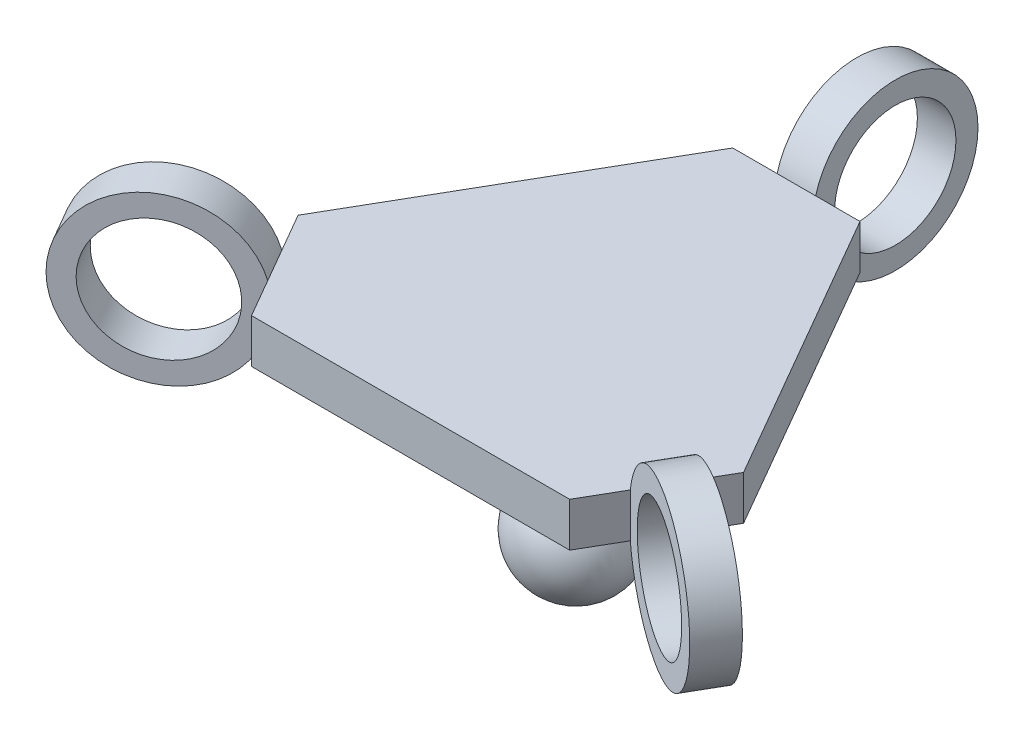
ISO-10303-21;
HEADER;
FILE_DESCRIPTION(('STEP AP214'),'2;1');
FILE_NAME('part.step','',(''),(''),'','','');
FILE_SCHEMA(('AUTOMOTIVE_DESIGN { 1 0 10303 214 1 1 1 1 }'));
ENDSEC;
DATA;
#1=APPLICATION_CONTEXT('core data for automotive mechanical design processes');
#2=APPLICATION_PROTOCOL_DEFINITION('international standard','automotive_design',2000,#1);
#3=PRODUCT_CONTEXT('',#1,'mechanical');
#4=PRODUCT('Part','Part','',(#3));
#5=PRODUCT_RELATED_PRODUCT_CATEGORY('part','',(#4));
#6=PRODUCT_DEFINITION_FORMATION('','',#4);
#7=PRODUCT_DEFINITION_CONTEXT('part definition',#1,'design');
#8=PRODUCT_DEFINITION('design','',#6,#7);
#9=PRODUCT_DEFINITION_SHAPE('','',#8);
#10=(LENGTH_UNIT() NAMED_UNIT(*) SI_UNIT(.MILLI.,.METRE.));
#11=(NAMED_UNIT(*) PLANE_ANGLE_UNIT() SI_UNIT($,.RADIAN.));
#12=(NAMED_UNIT(*) SI_UNIT($,.STERADIAN.) SOLID_ANGLE_UNIT());
#13=UNCERTAINTY_MEASURE_WITH_UNIT(LENGTH_MEASURE(1.E-05),#10,'distance_accuracy_value','');
#14=(GEOMETRIC_REPRESENTATION_CONTEXT(3) GLOBAL_UNCERTAINTY_ASSIGNED_CONTEXT((#13)) GLOBAL_UNIT_ASSIGNED_CONTEXT((#10,
#11,#12)) REPRESENTATION_CONTEXT('',''));
#15=CARTESIAN_POINT('',(0.,0.,0.));
#16=DIRECTION('',(0.,0.,1.));
#17=DIRECTION('',(1.,0.,0.));
#18=AXIS2_PLACEMENT_3D('',#15,#16,#17);
#19=CARTESIAN_POINT('',(0.,-26.,0.));
#20=DIRECTION('',(0.,0.,1.));
#21=DIRECTION('',(1.,0.,0.));
#22=AXIS2_PLACEMENT_3D('',#19,#20,#21);
#23=SPHERICAL_SURFACE('',#22,10.);
#24=CARTESIAN_POINT('',(0.,-26.,10.));
#25=VERTEX_POINT('',#24);
#26=VERTEX_LOOP('',#25);
#27=FACE_BOUND('',#26,.T.);
#28=ADVANCED_FACE('F42',(#27),#23,.T.);
#29=CLOSED_SHELL('',(#28));
#30=MANIFOLD_SOLID_BREP('B2',#29);
#31=CARTESIAN_POINT('',(0.,8.,0.));
#32=DIRECTION('',(0.,1.,0.));
#33=DIRECTION('',(0.,0.,1.));
#34=AXIS2_PLACEMENT_3D('',#31,#32,#33);
#35=PLANE('',#34);
#36=DIRECTION('',(-0.499999999999992,0.,0.866025403784443));
#37=VECTOR('',#36,1.);
#38=CARTESIAN_POINT('',(36.3877184662043,8.,16.9670071673316));
#39=LINE('',#38,#37);
#40=CARTESIAN_POINT('',(36.3877184662043,8.,16.9670071673316));
#41=VERTEX_POINT('',#40);
#42=CARTESIAN_POINT('',(32.8877184662044,8.,23.0291849938227));
#43=VERTEX_POINT('',#42);
#44=EDGE_CURVE('E73',#41,#43,#39,.T.);
#45=ORIENTED_EDGE('',*,*,#44,.F.);
#46=DIRECTION('',(0.866025403784443,0.,0.499999999999992));
#47=VECTOR('',#46,1.);
#48=CARTESIAN_POINT('',(1.74999999999997,8.,-3.03108891324555));
#49=LINE('',#48,#47);
#50=CARTESIAN_POINT('',(36.3910161513777,8.,16.9689110867541));
#51=VERTEX_POINT('',#50);
#52=EDGE_CURVE('E181',#41,#51,#49,.T.);
#53=ORIENTED_EDGE('',*,*,#52,.T.);
#54=DIRECTION('',(0.5,0.,-0.866025403784439));
#55=VECTOR('',#54,1.);
#56=CARTESIAN_POINT('',(28.8675134594813,8.,30.));
#57=LINE('',#56,#55);
#58=CARTESIAN_POINT('',(40.4145188432738,8.,9.99999999999998));
#59=VERTEX_POINT('',#58);
#60=EDGE_CURVE('E178',#51,#59,#57,.T.);
#61=ORIENTED_EDGE('',*,*,#60,.T.);
#62=DIRECTION('',(-0.5,0.,-0.866025403784438));
#63=VECTOR('',#62,1.);
#64=CARTESIAN_POINT('',(40.4145188432738,8.,9.99999999999998));
#65=LINE('',#64,#63);
#66=CARTESIAN_POINT('',(11.5470053837925,8.,-40.));
#67=VERTEX_POINT('',#66);
#68=EDGE_CURVE('E261',#59,#67,#65,.T.);
#69=ORIENTED_EDGE('',*,*,#68,.T.);
#70=DIRECTION('',(-1.,0.,0.));
#71=VECTOR('',#70,1.);
#72=CARTESIAN_POINT('',(11.5470053837925,8.,-40.));
#73=LINE('',#72,#71);
#74=CARTESIAN_POINT('',(3.5,8.,-40.));
#75=VERTEX_POINT('',#74);
#76=EDGE_CURVE('E265',#67,#75,#73,.T.);
#77=ORIENTED_EDGE('',*,*,#76,.T.);
#78=DIRECTION('',(0.,0.,-1.));
#79=VECTOR('',#78,1.);
#80=CARTESIAN_POINT('',(3.5,8.,0.));
#81=LINE('',#80,#79);
#82=CARTESIAN_POINT('',(3.5,8.,-39.9961921611549));
#83=VERTEX_POINT('',#82);
#84=EDGE_CURVE('E248',#83,#75,#81,.T.);
#85=ORIENTED_EDGE('',*,*,#84,.F.);
#86=DIRECTION('',(1.,0.,0.));
#87=VECTOR('',#86,1.);
#88=CARTESIAN_POINT('',(-3.5,8.,-39.9961921611549));
#89=LINE('',#88,#87);
#90=CARTESIAN_POINT('',(-3.5,8.,-39.9961921611549));
#91=VERTEX_POINT('',#90);
#92=EDGE_CURVE('E258',#91,#83,#89,.T.);
#93=ORIENTED_EDGE('',*,*,#92,.F.);
#94=DIRECTION('',(0.,0.,-1.));
#95=VECTOR('',#94,1.);
#96=CARTESIAN_POINT('',(-3.5,8.,0.));
#97=LINE('',#96,#95);
#98=CARTESIAN_POINT('',(-3.5,8.,-40.));
#99=VERTEX_POINT('',#98);
#100=EDGE_CURVE('E253',#91,#99,#97,.T.);
#101=ORIENTED_EDGE('',*,*,#100,.T.);
#102=CARTESIAN_POINT('',(-11.5470053837925,8.,-40.));
#103=VERTEX_POINT('',#102);
#104=EDGE_CURVE('E264',#99,#103,#73,.T.);
#105=ORIENTED_EDGE('',*,*,#104,.T.);
#106=DIRECTION('',(-0.5,0.,0.866025403784438));
#107=VECTOR('',#106,1.);
#108=CARTESIAN_POINT('',(-11.5470053837925,8.,-40.));
#109=LINE('',#108,#107);
#110=CARTESIAN_POINT('',(-40.4145188432738,8.,9.99999999999998));
#111=VERTEX_POINT('',#110);
#112=EDGE_CURVE('E268',#103,#111,#109,.T.);
#113=ORIENTED_EDGE('',*,*,#112,.T.);
#114=DIRECTION('',(0.5,0.,0.866025403784439));
#115=VECTOR('',#114,1.);
#116=CARTESIAN_POINT('',(-40.4145188432738,8.,9.99999999999998));
#117=LINE('',#116,#115);
#118=CARTESIAN_POINT('',(-36.3910161513775,8.,16.9689110867546));
#119=VERTEX_POINT('',#118);
#120=EDGE_CURVE('E271',#111,#119,#117,.T.);
#121=ORIENTED_EDGE('',*,*,#120,.T.);
#122=DIRECTION('',(-0.866025403784436,0.,0.500000000000004));
#123=VECTOR('',#122,1.);
#124=CARTESIAN_POINT('',(-1.75000000000001,8.,-3.03108891324553));
#125=LINE('',#124,#123);
#126=CARTESIAN_POINT('',(-36.3877184662041,8.,16.9670071673321));
#127=VERTEX_POINT('',#126);
#128=EDGE_CURVE('E214',#127,#119,#125,.T.);
#129=ORIENTED_EDGE('',*,*,#128,.F.);
#130=DIRECTION('',(-0.500000000000004,0.,-0.866025403784436));
#131=VECTOR('',#130,1.);
#132=CARTESIAN_POINT('',(-32.887718466204,8.,23.0291849938231));
#133=LINE('',#132,#131);
#134=CARTESIAN_POINT('',(-32.887718466204,8.,23.0291849938231));
#135=VERTEX_POINT('',#134);
#136=EDGE_CURVE('E224',#135,#127,#133,.T.);
#137=ORIENTED_EDGE('',*,*,#136,.F.);
#138=DIRECTION('',(-0.866025403784436,0.,0.500000000000004));
#139=VECTOR('',#138,1.);
#140=CARTESIAN_POINT('',(1.75000000000001,8.,3.03108891324553));
#141=LINE('',#140,#139);
#142=CARTESIAN_POINT('',(-32.8910161513775,8.,23.0310889132457));
#143=VERTEX_POINT('',#142);
#144=EDGE_CURVE('E219',#135,#143,#141,.T.);
#145=ORIENTED_EDGE('',*,*,#144,.T.);
#146=CARTESIAN_POINT('',(-28.8675134594813,8.,30.));
#147=VERTEX_POINT('',#146);
#148=EDGE_CURVE('E270',#143,#147,#117,.T.);
#149=ORIENTED_EDGE('',*,*,#148,.T.);
#150=DIRECTION('',(1.,0.,0.));
#151=VECTOR('',#150,1.);
#152=CARTESIAN_POINT('',(-28.8675134594813,8.,30.));
#153=LINE('',#152,#151);
#154=CARTESIAN_POINT('',(28.8675134594813,8.,30.));
#155=VERTEX_POINT('',#154);
#156=EDGE_CURVE('E274',#147,#155,#153,.T.);
#157=ORIENTED_EDGE('',*,*,#156,.T.);
#158=CARTESIAN_POINT('',(32.8910161513777,8.,23.0310889132452));
#159=VERTEX_POINT('',#158);
#160=EDGE_CURVE('E276',#155,#159,#57,.T.);
#161=ORIENTED_EDGE('',*,*,#160,.T.);
#162=DIRECTION('',(0.866025403784443,0.,0.499999999999992));
#163=VECTOR('',#162,1.);
#164=CARTESIAN_POINT('',(-1.74999999999997,8.,3.03108891324555));
#165=LINE('',#164,#163);
#166=EDGE_CURVE('E69',#43,#159,#165,.T.);
#167=ORIENTED_EDGE('',*,*,#166,.F.);
#168=EDGE_LOOP('',(#45,#53,#61,#69,#77,#85,#93,#101,#105,#113,#121,#129,#137,#145,#149,#157,
#161,#167));
#169=FACE_BOUND('',#168,.T.);
#170=ADVANCED_FACE('F54',(#169),#35,.T.);
#171=CARTESIAN_POINT('',(28.8675134594813,8.,30.));
#172=DIRECTION('',(-0.866025403784439,0.,-0.5));
#173=DIRECTION('',(-0.5,0.,0.866025403784439));
#174=AXIS2_PLACEMENT_3D('',#171,#172,#173);
#175=PLANE('',#174);
#176=DIRECTION('',(0.,1.,0.));
#177=VECTOR('',#176,1.);
#178=CARTESIAN_POINT('',(36.3910161513777,8.,16.9689110867541));
#179=LINE('',#178,#177);
#180=CARTESIAN_POINT('',(36.3910161513777,0.,16.9689110867541));
#181=VERTEX_POINT('',#180);
#182=EDGE_CURVE('E176',#181,#51,#179,.T.);
#183=ORIENTED_EDGE('',*,*,#182,.F.);
#184=DIRECTION('',(0.5,0.,-0.866025403784439));
#185=VECTOR('',#184,1.);
#186=CARTESIAN_POINT('',(28.8675134594813,0.,30.));
#187=LINE('',#186,#185);
#188=CARTESIAN_POINT('',(40.4145188432738,0.,9.99999999999998));
#189=VERTEX_POINT('',#188);
#190=EDGE_CURVE('E159',#181,#189,#187,.T.);
#191=ORIENTED_EDGE('',*,*,#190,.T.);
#192=DIRECTION('',(0.,-1.,0.));
#193=VECTOR('',#192,1.);
#194=CARTESIAN_POINT('',(40.4145188432738,8.,9.99999999999998));
#195=LINE('',#194,#193);
#196=EDGE_CURVE('E278',#59,#189,#195,.T.);
#197=ORIENTED_EDGE('',*,*,#196,.F.);
#198=ORIENTED_EDGE('',*,*,#60,.F.);
#199=EDGE_LOOP('',(#183,#191,#197,#198));
#200=FACE_BOUND('',#199,.T.);
#201=ADVANCED_FACE('F177',(#200),#175,.F.);
#202=CARTESIAN_POINT('',(-40.4145188432738,8.,9.99999999999998));
#203=DIRECTION('',(0.866025403784439,0.,-0.5));
#204=DIRECTION('',(-0.5,0.,-0.866025403784439));
#205=AXIS2_PLACEMENT_3D('',#202,#203,#204);
#206=PLANE('',#205);
#207=DIRECTION('',(0.,1.,0.));
#208=VECTOR('',#207,1.);
#209=CARTESIAN_POINT('',(-32.8910161513774,8.,23.0310889132457));
#210=LINE('',#209,#208);
#211=CARTESIAN_POINT('',(-32.8910161513774,0.,23.0310889132457));
#212=VERTEX_POINT('',#211);
#213=EDGE_CURVE('E221',#212,#143,#210,.T.);
#214=ORIENTED_EDGE('',*,*,#213,.F.);
#215=DIRECTION('',(0.5,0.,0.866025403784439));
#216=VECTOR('',#215,1.);
#217=CARTESIAN_POINT('',(-40.4145188432738,0.,9.99999999999998));
#218=LINE('',#217,#216);
#219=CARTESIAN_POINT('',(-28.8675134594813,0.,30.));
#220=VERTEX_POINT('',#219);
#221=EDGE_CURVE('E287',#212,#220,#218,.T.);
#222=ORIENTED_EDGE('',*,*,#221,.T.);
#223=DIRECTION('',(0.,-1.,0.));
#224=VECTOR('',#223,1.);
#225=CARTESIAN_POINT('',(-28.8675134594813,8.,30.));
#226=LINE('',#225,#224);
#227=EDGE_CURVE('E296',#147,#220,#226,.T.);
#228=ORIENTED_EDGE('',*,*,#227,.F.);
#229=ORIENTED_EDGE('',*,*,#148,.F.);
#230=EDGE_LOOP('',(#214,#222,#228,#229));
#231=FACE_BOUND('',#230,.T.);
#232=ADVANCED_FACE('F328',(#231),#206,.F.);
#233=CARTESIAN_POINT('',(11.5470053837925,8.,-40.));
#234=DIRECTION('',(0.,0.,1.));
#235=DIRECTION('',(1.,0.,0.));
#236=AXIS2_PLACEMENT_3D('',#233,#234,#235);
#237=PLANE('',#236);
#238=DIRECTION('',(0.,1.,0.));
#239=VECTOR('',#238,1.);
#240=CARTESIAN_POINT('',(-3.5,8.,-40.));
#241=LINE('',#240,#239);
#242=CARTESIAN_POINT('',(-3.5,0.,-40.));
#243=VERTEX_POINT('',#242);
#244=EDGE_CURVE('E255',#243,#99,#241,.T.);
#245=ORIENTED_EDGE('',*,*,#244,.F.);
#246=DIRECTION('',(-1.,0.,0.));
#247=VECTOR('',#246,1.);
#248=CARTESIAN_POINT('',(11.5470053837925,0.,-40.));
#249=LINE('',#248,#247);
#250=CARTESIAN_POINT('',(-11.5470053837925,0.,-40.));
#251=VERTEX_POINT('',#250);
#252=EDGE_CURVE('E280',#243,#251,#249,.T.);
#253=ORIENTED_EDGE('',*,*,#252,.T.);
#254=DIRECTION('',(0.,-1.,0.));
#255=VECTOR('',#254,1.);
#256=CARTESIAN_POINT('',(-11.5470053837925,8.,-40.));
#257=LINE('',#256,#255);
#258=EDGE_CURVE('E62',#103,#251,#257,.T.);
#259=ORIENTED_EDGE('',*,*,#258,.F.);
#260=ORIENTED_EDGE('',*,*,#104,.F.);
#261=EDGE_LOOP('',(#245,#253,#259,#260));
#262=FACE_BOUND('',#261,.T.);
#263=ADVANCED_FACE('F378',(#262),#237,.F.);
#264=CARTESIAN_POINT('',(40.4145188432738,8.,9.99999999999998));
#265=DIRECTION('',(-0.866025403784439,0.,0.5));
#266=DIRECTION('',(0.5,0.,0.866025403784439));
#267=AXIS2_PLACEMENT_3D('',#264,#265,#266);
#268=PLANE('',#267);
#269=DIRECTION('',(-0.5,0.,-0.866025403784438));
#270=VECTOR('',#269,1.);
#271=CARTESIAN_POINT('',(40.4145188432738,0.,9.99999999999998));
#272=LINE('',#271,#270);
#273=CARTESIAN_POINT('',(11.5470053837925,0.,-40.));
#274=VERTEX_POINT('',#273);
#275=EDGE_CURVE('E167',#189,#274,#272,.T.);
#276=ORIENTED_EDGE('',*,*,#275,.T.);
#277=DIRECTION('',(0.,-1.,0.));
#278=VECTOR('',#277,1.);
#279=CARTESIAN_POINT('',(11.5470053837925,8.,-40.));
#280=LINE('',#279,#278);
#281=EDGE_CURVE('E40',#67,#274,#280,.T.);
#282=ORIENTED_EDGE('',*,*,#281,.F.);
#283=ORIENTED_EDGE('',*,*,#68,.F.);
#284=ORIENTED_EDGE('',*,*,#196,.T.);
#285=EDGE_LOOP('',(#276,#282,#283,#284));
#286=FACE_BOUND('',#285,.T.);
#287=ADVANCED_FACE('F56',(#286),#268,.F.);
#288=CARTESIAN_POINT('',(3.5,0.,-40.));
#289=VERTEX_POINT('',#288);
#290=EDGE_CURVE('E281',#274,#289,#249,.T.);
#291=ORIENTED_EDGE('',*,*,#290,.T.);
#292=DIRECTION('',(0.,1.,0.));
#293=VECTOR('',#292,1.);
#294=CARTESIAN_POINT('',(3.5,8.,-40.));
#295=LINE('',#294,#293);
#296=EDGE_CURVE('E251',#289,#75,#295,.T.);
#297=ORIENTED_EDGE('',*,*,#296,.T.);
#298=ORIENTED_EDGE('',*,*,#76,.F.);
#299=ORIENTED_EDGE('',*,*,#281,.T.);
#300=EDGE_LOOP('',(#291,#297,#298,#299));
#301=FACE_BOUND('',#300,.T.);
#302=ADVANCED_FACE('F375',(#301),#237,.F.);
#303=CARTESIAN_POINT('',(-11.5470053837925,8.,-40.));
#304=DIRECTION('',(0.866025403784439,0.,0.5));
#305=DIRECTION('',(0.5,0.,-0.866025403784438));
#306=AXIS2_PLACEMENT_3D('',#303,#304,#305);
#307=PLANE('',#306);
#308=DIRECTION('',(-0.5,0.,0.866025403784438));
#309=VECTOR('',#308,1.);
#310=CARTESIAN_POINT('',(-11.5470053837925,0.,-40.));
#311=LINE('',#310,#309);
#312=CARTESIAN_POINT('',(-40.4145188432738,0.,9.99999999999998));
#313=VERTEX_POINT('',#312);
#314=EDGE_CURVE('E284',#251,#313,#311,.T.);
#315=ORIENTED_EDGE('',*,*,#314,.T.);
#316=DIRECTION('',(0.,-1.,0.));
#317=VECTOR('',#316,1.);
#318=CARTESIAN_POINT('',(-40.4145188432738,8.,9.99999999999998));
#319=LINE('',#318,#317);
#320=EDGE_CURVE('E299',#111,#313,#319,.T.);
#321=ORIENTED_EDGE('',*,*,#320,.F.);
#322=ORIENTED_EDGE('',*,*,#112,.F.);
#323=ORIENTED_EDGE('',*,*,#258,.T.);
#324=EDGE_LOOP('',(#315,#321,#322,#323));
#325=FACE_BOUND('',#324,.T.);
#326=ADVANCED_FACE('F306',(#325),#307,.F.);
#327=CARTESIAN_POINT('',(-36.3910161513775,0.,16.9689110867546));
#328=VERTEX_POINT('',#327);
#329=EDGE_CURVE('E288',#313,#328,#218,.T.);
#330=ORIENTED_EDGE('',*,*,#329,.T.);
#331=DIRECTION('',(0.,1.,0.));
#332=VECTOR('',#331,1.);
#333=CARTESIAN_POINT('',(-36.3910161513775,8.,16.9689110867546));
#334=LINE('',#333,#332);
#335=EDGE_CURVE('E217',#328,#119,#334,.T.);
#336=ORIENTED_EDGE('',*,*,#335,.T.);
#337=ORIENTED_EDGE('',*,*,#120,.F.);
#338=ORIENTED_EDGE('',*,*,#320,.T.);
#339=EDGE_LOOP('',(#330,#336,#337,#338));
#340=FACE_BOUND('',#339,.T.);
#341=ADVANCED_FACE('F314',(#340),#206,.F.);
#342=CARTESIAN_POINT('',(-28.8675134594813,8.,30.));
#343=DIRECTION('',(0.,0.,-1.));
#344=DIRECTION('',(-1.,0.,0.));
#345=AXIS2_PLACEMENT_3D('',#342,#343,#344);
#346=PLANE('',#345);
#347=DIRECTION('',(1.,0.,0.));
#348=VECTOR('',#347,1.);
#349=CARTESIAN_POINT('',(-28.8675134594813,0.,30.));
#350=LINE('',#349,#348);
#351=CARTESIAN_POINT('',(28.8675134594813,0.,30.));
#352=VERTEX_POINT('',#351);
#353=EDGE_CURVE('E172',#220,#352,#350,.T.);
#354=ORIENTED_EDGE('',*,*,#353,.T.);
#355=DIRECTION('',(0.,-1.,0.));
#356=VECTOR('',#355,1.);
#357=CARTESIAN_POINT('',(28.8675134594813,8.,30.));
#358=LINE('',#357,#356);
#359=EDGE_CURVE('E293',#155,#352,#358,.T.);
#360=ORIENTED_EDGE('',*,*,#359,.F.);
#361=ORIENTED_EDGE('',*,*,#156,.F.);
#362=ORIENTED_EDGE('',*,*,#227,.T.);
#363=EDGE_LOOP('',(#354,#360,#361,#362));
#364=FACE_BOUND('',#363,.T.);
#365=ADVANCED_FACE('F334',(#364),#346,.F.);
#366=CARTESIAN_POINT('',(32.8910161513777,0.,23.0310889132452));
#367=VERTEX_POINT('',#366);
#368=EDGE_CURVE('E171',#352,#367,#187,.T.);
#369=ORIENTED_EDGE('',*,*,#368,.T.);
#370=DIRECTION('',(0.,1.,0.));
#371=VECTOR('',#370,1.);
#372=CARTESIAN_POINT('',(32.8910161513778,8.,23.0310889132452));
#373=LINE('',#372,#371);
#374=EDGE_CURVE('E194',#367,#159,#373,.T.);
#375=ORIENTED_EDGE('',*,*,#374,.T.);
#376=ORIENTED_EDGE('',*,*,#160,.F.);
#377=ORIENTED_EDGE('',*,*,#359,.T.);
#378=EDGE_LOOP('',(#369,#375,#376,#377));
#379=FACE_BOUND('',#378,.T.);
#380=ADVANCED_FACE('F337',(#379),#175,.F.);
#381=CARTESIAN_POINT('',(0.,0.,0.));
#382=DIRECTION('',(0.,1.,0.));
#383=DIRECTION('',(0.,0.,1.));
#384=AXIS2_PLACEMENT_3D('',#381,#382,#383);
#385=PLANE('',#384);
#386=CARTESIAN_POINT('',(0.,0.,0.));
#387=DIRECTION('',(0.,1.,0.));
#388=DIRECTION('',(0.,0.,1.));
#389=AXIS2_PLACEMENT_3D('',#386,#387,#388);
#390=CIRCLE('',#389,5.);
#391=CARTESIAN_POINT('',(0.,0.,5.));
#392=VERTEX_POINT('',#391);
#393=EDGE_CURVE('E233',#392,#392,#390,.T.);
#394=ORIENTED_EDGE('',*,*,#393,.T.);
#395=EDGE_LOOP('',(#394));
#396=FACE_BOUND('',#395,.T.);
#397=ORIENTED_EDGE('',*,*,#275,.F.);
#398=ORIENTED_EDGE('',*,*,#190,.F.);
#399=DIRECTION('',(0.499999999999992,0.,-0.866025403784443));
#400=VECTOR('',#399,1.);
#401=CARTESIAN_POINT('',(28.8675134594816,0.,29.9999999999997));
#402=LINE('',#401,#400);
#403=EDGE_CURVE('E164',#367,#181,#402,.T.);
#404=ORIENTED_EDGE('',*,*,#403,.F.);
#405=ORIENTED_EDGE('',*,*,#368,.F.);
#406=ORIENTED_EDGE('',*,*,#353,.F.);
#407=ORIENTED_EDGE('',*,*,#221,.F.);
#408=DIRECTION('',(0.500000000000004,0.,0.866025403784436));
#409=VECTOR('',#408,1.);
#410=CARTESIAN_POINT('',(-40.4145188432738,0.,10.0000000000002));
#411=LINE('',#410,#409);
#412=EDGE_CURVE('E227',#328,#212,#411,.T.);
#413=ORIENTED_EDGE('',*,*,#412,.F.);
#414=ORIENTED_EDGE('',*,*,#329,.F.);
#415=ORIENTED_EDGE('',*,*,#314,.F.);
#416=ORIENTED_EDGE('',*,*,#252,.F.);
#417=EDGE_CURVE('E285',#289,#243,#249,.T.);
#418=ORIENTED_EDGE('',*,*,#417,.F.);
#419=ORIENTED_EDGE('',*,*,#290,.F.);
#420=EDGE_LOOP('',(#397,#398,#404,#405,#406,#407,#413,#414,#415,#416,#418,#419));
#421=FACE_BOUND('',#420,.T.);
#422=ADVANCED_FACE('F161',(#396,#421),#385,.F.);
#423=CARTESIAN_POINT('',(-3.5,4.00688116010952,-54.4549266123616));
#424=DIRECTION('',(1.,0.,0.));
#425=DIRECTION('',(0.,0.,-1.));
#426=AXIS2_PLACEMENT_3D('',#423,#424,#425);
#427=PLANE('',#426);
#428=CARTESIAN_POINT('',(-3.5,4.00688116010952,-54.4549266123616));
#429=DIRECTION('',(1.,0.,0.));
#430=DIRECTION('',(0.,0.,-1.));
#431=AXIS2_PLACEMENT_3D('',#428,#429,#430);
#432=CIRCLE('',#431,11.);
#433=CARTESIAN_POINT('',(-3.5,4.00688116010952,-65.4549266123616));
#434=VERTEX_POINT('',#433);
#435=EDGE_CURVE('E239',#434,#434,#432,.T.);
#436=ORIENTED_EDGE('',*,*,#435,.T.);
#437=EDGE_LOOP('',(#436));
#438=FACE_BOUND('',#437,.T.);
#439=CARTESIAN_POINT('',(-3.5,4.00688116010952,-54.4549266123616));
#440=DIRECTION('',(1.,0.,0.));
#441=DIRECTION('',(0.,0.,-1.));
#442=AXIS2_PLACEMENT_3D('',#439,#440,#441);
#443=CIRCLE('',#442,15.);
#444=EDGE_CURVE('E245',#243,#91,#443,.T.);
#445=ORIENTED_EDGE('',*,*,#444,.F.);
#446=ORIENTED_EDGE('',*,*,#244,.T.);
#447=ORIENTED_EDGE('',*,*,#100,.F.);
#448=EDGE_LOOP('',(#445,#446,#447));
#449=FACE_BOUND('',#448,.T.);
#450=ADVANCED_FACE('F366',(#438,#449),#427,.F.);
#451=CARTESIAN_POINT('',(3.5,4.00688116010952,-54.4549266123616));
#452=DIRECTION('',(1.,0.,0.));
#453=DIRECTION('',(0.,0.,-1.));
#454=AXIS2_PLACEMENT_3D('',#451,#452,#453);
#455=PLANE('',#454);
#456=CARTESIAN_POINT('',(3.5,4.00688116010952,-54.4549266123616));
#457=DIRECTION('',(1.,0.,0.));
#458=DIRECTION('',(0.,0.,-1.));
#459=AXIS2_PLACEMENT_3D('',#456,#457,#458);
#460=CIRCLE('',#459,11.);
#461=CARTESIAN_POINT('',(3.5,4.00688116010952,-65.4549266123616));
#462=VERTEX_POINT('',#461);
#463=EDGE_CURVE('E236',#462,#462,#460,.T.);
#464=ORIENTED_EDGE('',*,*,#463,.F.);
#465=EDGE_LOOP('',(#464));
#466=FACE_BOUND('',#465,.T.);
#467=ORIENTED_EDGE('',*,*,#296,.F.);
#468=CARTESIAN_POINT('',(3.5,4.00688116010952,-54.4549266123616));
#469=DIRECTION('',(1.,0.,0.));
#470=DIRECTION('',(0.,0.,-1.));
#471=AXIS2_PLACEMENT_3D('',#468,#469,#470);
#472=CIRCLE('',#471,15.);
#473=EDGE_CURVE('E242',#289,#83,#472,.T.);
#474=ORIENTED_EDGE('',*,*,#473,.T.);
#475=ORIENTED_EDGE('',*,*,#84,.T.);
#476=EDGE_LOOP('',(#467,#474,#475));
#477=FACE_BOUND('',#476,.T.);
#478=ADVANCED_FACE('F395',(#466,#477),#455,.T.);
#479=CARTESIAN_POINT('',(-3.5,4.00688116010952,-54.4549266123616));
#480=DIRECTION('',(1.,0.,0.));
#481=DIRECTION('',(0.,0.,-1.));
#482=AXIS2_PLACEMENT_3D('',#479,#480,#481);
#483=CYLINDRICAL_SURFACE('',#482,15.);
#484=ORIENTED_EDGE('',*,*,#444,.T.);
#485=ORIENTED_EDGE('',*,*,#92,.T.);
#486=ORIENTED_EDGE('',*,*,#473,.F.);
#487=ORIENTED_EDGE('',*,*,#417,.T.);
#488=EDGE_LOOP('',(#484,#485,#486,#487));
#489=FACE_BOUND('',#488,.T.);
#490=ADVANCED_FACE('F363',(#489),#483,.T.);
#491=CARTESIAN_POINT('',(-16.,4.00688116010952,-54.4549266123616));
#492=DIRECTION('',(1.,0.,0.));
#493=DIRECTION('',(0.,0.,-1.));
#494=AXIS2_PLACEMENT_3D('',#491,#492,#493);
#495=CYLINDRICAL_SURFACE('',#494,11.);
#496=ORIENTED_EDGE('',*,*,#463,.T.);
#497=EDGE_LOOP('',(#496));
#498=FACE_BOUND('',#497,.T.);
#499=ORIENTED_EDGE('',*,*,#435,.F.);
#500=EDGE_LOOP('',(#499));
#501=FACE_BOUND('',#500,.T.);
#502=ADVANCED_FACE('F405',(#498,#501),#495,.F.);
#503=CARTESIAN_POINT('',(0.,-26.,0.));
#504=DIRECTION('',(0.,1.,0.));
#505=DIRECTION('',(0.,0.,1.));
#506=AXIS2_PLACEMENT_3D('',#503,#504,#505);
#507=CYLINDRICAL_SURFACE('',#506,5.);
#508=CARTESIAN_POINT('',(0.,-26.,0.));
#509=DIRECTION('',(0.,1.,0.));
#510=DIRECTION('',(0.,0.,1.));
#511=AXIS2_PLACEMENT_3D('',#508,#509,#510);
#512=CIRCLE('',#511,5.);
#513=CARTESIAN_POINT('',(0.,-26.,5.));
#514=VERTEX_POINT('',#513);
#515=EDGE_CURVE('E230',#514,#514,#512,.T.);
#516=ORIENTED_EDGE('',*,*,#515,.T.);
#517=EDGE_LOOP('',(#516));
#518=FACE_BOUND('',#517,.T.);
#519=ORIENTED_EDGE('',*,*,#393,.F.);
#520=EDGE_LOOP('',(#519));
#521=FACE_BOUND('',#520,.T.);
#522=ADVANCED_FACE('F411',(#518,#521),#507,.T.);
#523=CARTESIAN_POINT('',(0.,-26.,0.));
#524=DIRECTION('',(0.,1.,0.));
#525=DIRECTION('',(0.,0.,1.));
#526=AXIS2_PLACEMENT_3D('',#523,#524,#525);
#527=PLANE('',#526);
#528=ORIENTED_EDGE('',*,*,#515,.F.);
#529=EDGE_LOOP('',(#528));
#530=FACE_BOUND('',#529,.T.);
#531=ADVANCED_FACE('F415',(#530),#527,.F.);
#532=CARTESIAN_POINT('',(-45.4093498075223,4.00688116010952,30.2585522194265));
#533=DIRECTION('',(-0.500000000000004,0.,-0.866025403784436));
#534=DIRECTION('',(-0.866025403784436,0.,0.500000000000004));
#535=AXIS2_PLACEMENT_3D('',#532,#533,#534);
#536=PLANE('',#535);
#537=CARTESIAN_POINT('',(-45.4093498075223,4.00688116010952,30.2585522194265));
#538=DIRECTION('',(-0.500000000000004,0.,-0.866025403784436));
#539=DIRECTION('',(-0.866025403784436,0.,0.500000000000004));
#540=AXIS2_PLACEMENT_3D('',#537,#538,#539);
#541=CIRCLE('',#540,11.);
#542=CARTESIAN_POINT('',(-54.9356292491511,4.00688116010952,35.7585522194266));
#543=VERTEX_POINT('',#542);
#544=EDGE_CURVE('E205',#543,#543,#541,.T.);
#545=ORIENTED_EDGE('',*,*,#544,.T.);
#546=EDGE_LOOP('',(#545));
#547=FACE_BOUND('',#546,.T.);
#548=CARTESIAN_POINT('',(-45.4093498075223,4.00688116010952,30.2585522194265));
#549=DIRECTION('',(-0.500000000000004,0.,-0.866025403784436));
#550=DIRECTION('',(-0.866025403784436,0.,0.500000000000004));
#551=AXIS2_PLACEMENT_3D('',#548,#549,#550);
#552=CIRCLE('',#551,15.);
#553=EDGE_CURVE('E211',#212,#135,#552,.T.);
#554=ORIENTED_EDGE('',*,*,#553,.F.);
#555=ORIENTED_EDGE('',*,*,#213,.T.);
#556=ORIENTED_EDGE('',*,*,#144,.F.);
#557=EDGE_LOOP('',(#554,#555,#556));
#558=FACE_BOUND('',#557,.T.);
#559=ADVANCED_FACE('F325',(#547,#558),#536,.F.);
#560=CARTESIAN_POINT('',(-48.9093498075223,4.00688116010952,24.1963743929355));
#561=DIRECTION('',(-0.500000000000004,0.,-0.866025403784436));
#562=DIRECTION('',(-0.866025403784436,0.,0.500000000000004));
#563=AXIS2_PLACEMENT_3D('',#560,#561,#562);
#564=PLANE('',#563);
#565=CARTESIAN_POINT('',(-48.9093498075223,4.00688116010952,24.1963743929355));
#566=DIRECTION('',(-0.500000000000004,0.,-0.866025403784436));
#567=DIRECTION('',(-0.866025403784436,0.,0.500000000000004));
#568=AXIS2_PLACEMENT_3D('',#565,#566,#567);
#569=CIRCLE('',#568,11.);
#570=CARTESIAN_POINT('',(-58.4356292491511,4.00688116010952,29.6963743929355));
#571=VERTEX_POINT('',#570);
#572=EDGE_CURVE('E190',#571,#571,#569,.T.);
#573=ORIENTED_EDGE('',*,*,#572,.F.);
#574=EDGE_LOOP('',(#573));
#575=FACE_BOUND('',#574,.T.);
#576=ORIENTED_EDGE('',*,*,#335,.F.);
#577=CARTESIAN_POINT('',(-48.9093498075223,4.00688116010952,24.1963743929355));
#578=DIRECTION('',(-0.500000000000004,0.,-0.866025403784436));
#579=DIRECTION('',(-0.866025403784436,0.,0.500000000000004));
#580=AXIS2_PLACEMENT_3D('',#577,#578,#579);
#581=CIRCLE('',#580,15.);
#582=EDGE_CURVE('E208',#328,#127,#581,.T.);
#583=ORIENTED_EDGE('',*,*,#582,.T.);
#584=ORIENTED_EDGE('',*,*,#128,.T.);
#585=EDGE_LOOP('',(#576,#583,#584));
#586=FACE_BOUND('',#585,.T.);
#587=ADVANCED_FACE('F318',(#575,#586),#564,.T.);
#588=CARTESIAN_POINT('',(-45.4093498075223,4.00688116010952,30.2585522194265));
#589=DIRECTION('',(-0.500000000000004,0.,-0.866025403784436));
#590=DIRECTION('',(-0.866025403784436,0.,0.500000000000004));
#591=AXIS2_PLACEMENT_3D('',#588,#589,#590);
#592=CYLINDRICAL_SURFACE('',#591,15.);
#593=ORIENTED_EDGE('',*,*,#553,.T.);
#594=ORIENTED_EDGE('',*,*,#136,.T.);
#595=ORIENTED_EDGE('',*,*,#582,.F.);
#596=ORIENTED_EDGE('',*,*,#412,.T.);
#597=EDGE_LOOP('',(#593,#594,#595,#596));
#598=FACE_BOUND('',#597,.T.);
#599=ADVANCED_FACE('F320',(#598),#592,.T.);
#600=CARTESIAN_POINT('',(-39.1593498075222,4.00688116010952,41.083869766732));
#601=DIRECTION('',(-0.500000000000004,0.,-0.866025403784436));
#602=DIRECTION('',(-0.866025403784436,0.,0.500000000000004));
#603=AXIS2_PLACEMENT_3D('',#600,#601,#602);
#604=CYLINDRICAL_SURFACE('',#603,11.);
#605=ORIENTED_EDGE('',*,*,#572,.T.);
#606=EDGE_LOOP('',(#605));
#607=FACE_BOUND('',#606,.T.);
#608=ORIENTED_EDGE('',*,*,#544,.F.);
#609=EDGE_LOOP('',(#608));
#610=FACE_BOUND('',#609,.T.);
#611=ADVANCED_FACE('F350',(#607,#610),#604,.F.);
#612=CARTESIAN_POINT('',(48.9093498075226,4.00688116010952,24.1963743929348));
#613=DIRECTION('',(-0.499999999999992,0.,0.866025403784443));
#614=DIRECTION('',(0.866025403784443,0.,0.499999999999992));
#615=AXIS2_PLACEMENT_3D('',#612,#613,#614);
#616=PLANE('',#615);
#617=CARTESIAN_POINT('',(48.9093498075226,4.00688116010952,24.1963743929348));
#618=DIRECTION('',(-0.499999999999992,0.,0.866025403784443));
#619=DIRECTION('',(0.866025403784443,0.,0.499999999999992));
#620=AXIS2_PLACEMENT_3D('',#617,#618,#619);
#621=CIRCLE('',#620,11.);
#622=CARTESIAN_POINT('',(58.4356292491515,4.00688116010952,29.6963743929347));
#623=VERTEX_POINT('',#622);
#624=EDGE_CURVE('E196',#623,#623,#621,.T.);
#625=ORIENTED_EDGE('',*,*,#624,.T.);
#626=EDGE_LOOP('',(#625));
#627=FACE_BOUND('',#626,.T.);
#628=CARTESIAN_POINT('',(48.9093498075226,4.00688116010952,24.1963743929348));
#629=DIRECTION('',(-0.499999999999992,0.,0.866025403784443));
#630=DIRECTION('',(0.866025403784443,0.,0.499999999999992));
#631=AXIS2_PLACEMENT_3D('',#628,#629,#630);
#632=CIRCLE('',#631,15.);
#633=EDGE_CURVE('E187',#181,#41,#632,.T.);
#634=ORIENTED_EDGE('',*,*,#633,.F.);
#635=ORIENTED_EDGE('',*,*,#182,.T.);
#636=ORIENTED_EDGE('',*,*,#52,.F.);
#637=EDGE_LOOP('',(#634,#635,#636));
#638=FACE_BOUND('',#637,.T.);
#639=ADVANCED_FACE('F192',(#627,#638),#616,.F.);
#640=CARTESIAN_POINT('',(45.4093498075227,4.00688116010952,30.2585522194259));
#641=DIRECTION('',(-0.499999999999992,0.,0.866025403784443));
#642=DIRECTION('',(0.866025403784443,0.,0.499999999999992));
#643=AXIS2_PLACEMENT_3D('',#640,#641,#642);
#644=PLANE('',#643);
#645=CARTESIAN_POINT('',(45.4093498075227,4.00688116010952,30.2585522194259));
#646=DIRECTION('',(-0.499999999999992,0.,0.866025403784443));
#647=DIRECTION('',(0.866025403784443,0.,0.499999999999992));
#648=AXIS2_PLACEMENT_3D('',#645,#646,#647);
#649=CIRCLE('',#648,11.);
#650=CARTESIAN_POINT('',(54.9356292491516,4.00688116010952,35.7585522194258));
#651=VERTEX_POINT('',#650);
#652=EDGE_CURVE('E580',#651,#651,#649,.T.);
#653=ORIENTED_EDGE('',*,*,#652,.F.);
#654=EDGE_LOOP('',(#653));
#655=FACE_BOUND('',#654,.T.);
#656=ORIENTED_EDGE('',*,*,#374,.F.);
#657=CARTESIAN_POINT('',(45.4093498075227,4.00688116010952,30.2585522194259));
#658=DIRECTION('',(-0.499999999999992,0.,0.866025403784443));
#659=DIRECTION('',(0.866025403784443,0.,0.499999999999992));
#660=AXIS2_PLACEMENT_3D('',#657,#658,#659);
#661=CIRCLE('',#660,15.);
#662=EDGE_CURVE('E189',#367,#43,#661,.T.);
#663=ORIENTED_EDGE('',*,*,#662,.T.);
#664=ORIENTED_EDGE('',*,*,#166,.T.);
#665=EDGE_LOOP('',(#656,#663,#664));
#666=FACE_BOUND('',#665,.T.);
#667=ADVANCED_FACE('F340',(#655,#666),#644,.T.);
#668=CARTESIAN_POINT('',(48.9093498075226,4.00688116010952,24.1963743929348));
#669=DIRECTION('',(-0.499999999999992,0.,0.866025403784443));
#670=DIRECTION('',(0.866025403784443,0.,0.499999999999992));
#671=AXIS2_PLACEMENT_3D('',#668,#669,#670);
#672=CYLINDRICAL_SURFACE('',#671,15.);
#673=ORIENTED_EDGE('',*,*,#633,.T.);
#674=ORIENTED_EDGE('',*,*,#44,.T.);
#675=ORIENTED_EDGE('',*,*,#662,.F.);
#676=ORIENTED_EDGE('',*,*,#403,.T.);
#677=EDGE_LOOP('',(#673,#674,#675,#676));
#678=FACE_BOUND('',#677,.T.);
#679=ADVANCED_FACE('F186',(#678),#672,.T.);
#680=CARTESIAN_POINT('',(55.1593498075225,4.00688116010952,13.3710568456293));
#681=DIRECTION('',(-0.499999999999992,0.,0.866025403784443));
#682=DIRECTION('',(0.866025403784443,0.,0.499999999999992));
#683=AXIS2_PLACEMENT_3D('',#680,#681,#682);
#684=CYLINDRICAL_SURFACE('',#683,11.);
#685=ORIENTED_EDGE('',*,*,#652,.T.);
#686=EDGE_LOOP('',(#685));
#687=FACE_BOUND('',#686,.T.);
#688=ORIENTED_EDGE('',*,*,#624,.F.);
#689=EDGE_LOOP('',(#688));
#690=FACE_BOUND('',#689,.T.);
#691=ADVANCED_FACE('F348',(#687,#690),#684,.F.);
#692=CLOSED_SHELL('',(#170,#201,#232,#263,#287,#302,#326,#341,#365,#380,#422,#450,#478,#490,
#502,#522,#531,#559,#587,#599,#611,#639,#667,#679,#691));
#693=MANIFOLD_SOLID_BREP('B6',#692);
#694=ADVANCED_BREP_SHAPE_REPRESENTATION('',(#18,#30,#693),#14);
#695=SHAPE_DEFINITION_REPRESENTATION(#9,#694);
ENDSEC;
END-ISO-10303-21;
